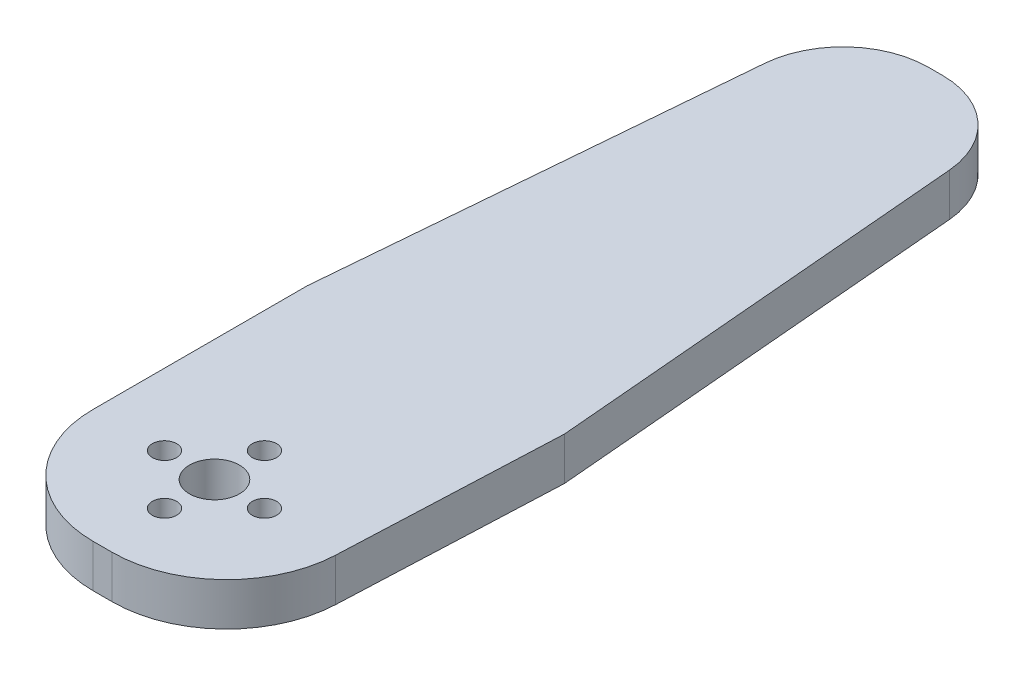
ISO-10303-21;
HEADER;
FILE_DESCRIPTION(('STEP AP214'),'2;1');
FILE_NAME('part.step','',(''),(''),'','','');
FILE_SCHEMA(('AUTOMOTIVE_DESIGN { 1 0 10303 214 1 1 1 1 }'));
ENDSEC;
DATA;
#1=APPLICATION_CONTEXT('core data for automotive mechanical design processes');
#2=APPLICATION_PROTOCOL_DEFINITION('international standard','automotive_design',2000,#1);
#3=PRODUCT_CONTEXT('',#1,'mechanical');
#4=PRODUCT('Part','Part','',(#3));
#5=PRODUCT_RELATED_PRODUCT_CATEGORY('part','',(#4));
#6=PRODUCT_DEFINITION_FORMATION('','',#4);
#7=PRODUCT_DEFINITION_CONTEXT('part definition',#1,'design');
#8=PRODUCT_DEFINITION('design','',#6,#7);
#9=PRODUCT_DEFINITION_SHAPE('','',#8);
#10=(LENGTH_UNIT() NAMED_UNIT(*) SI_UNIT(.MILLI.,.METRE.));
#11=(NAMED_UNIT(*) PLANE_ANGLE_UNIT() SI_UNIT($,.RADIAN.));
#12=(NAMED_UNIT(*) SI_UNIT($,.STERADIAN.) SOLID_ANGLE_UNIT());
#13=UNCERTAINTY_MEASURE_WITH_UNIT(LENGTH_MEASURE(1.E-05),#10,'distance_accuracy_value','');
#14=(GEOMETRIC_REPRESENTATION_CONTEXT(3) GLOBAL_UNCERTAINTY_ASSIGNED_CONTEXT((#13)) GLOBAL_UNIT_ASSIGNED_CONTEXT((#10,
#11,#12)) REPRESENTATION_CONTEXT('',''));
#15=CARTESIAN_POINT('',(0.,0.,0.));
#16=DIRECTION('',(0.,0.,1.));
#17=DIRECTION('',(1.,0.,0.));
#18=AXIS2_PLACEMENT_3D('',#15,#16,#17);
#19=CARTESIAN_POINT('',(-0.999970982587433,0.,-2.90174125647941E-05));
#20=DIRECTION('',(0.,-1.,0.));
#21=DIRECTION('',(0.,0.,-1.));
#22=AXIS2_PLACEMENT_3D('',#19,#20,#21);
#23=CYLINDRICAL_SURFACE('',#22,16.0000290174389);
#24=CARTESIAN_POINT('',(-0.999970982587433,-6.,-2.90174125647941E-05));
#25=DIRECTION('',(0.,1.,0.));
#26=DIRECTION('',(0.,0.,1.));
#27=AXIS2_PLACEMENT_3D('',#24,#25,#26);
#28=CIRCLE('',#27,16.0000290174389);
#29=CARTESIAN_POINT('',(-17.,-6.,0.));
#30=VERTEX_POINT('',#29);
#31=CARTESIAN_POINT('',(-1.,-6.,16.));
#32=VERTEX_POINT('',#31);
#33=EDGE_CURVE('E149',#30,#32,#28,.T.);
#34=ORIENTED_EDGE('',*,*,#33,.T.);
#35=DIRECTION('',(0.,-1.,0.));
#36=VECTOR('',#35,1.);
#37=CARTESIAN_POINT('',(-1.,0.,16.));
#38=LINE('',#37,#36);
#39=CARTESIAN_POINT('',(-1.,0.,16.));
#40=VERTEX_POINT('',#39);
#41=EDGE_CURVE('E11',#40,#32,#38,.T.);
#42=ORIENTED_EDGE('',*,*,#41,.F.);
#43=CARTESIAN_POINT('',(-0.999970982587433,0.,-2.90174125647941E-05));
#44=DIRECTION('',(0.,1.,0.));
#45=DIRECTION('',(0.,0.,1.));
#46=AXIS2_PLACEMENT_3D('',#43,#44,#45);
#47=CIRCLE('',#46,16.0000290174389);
#48=CARTESIAN_POINT('',(-17.,0.,0.));
#49=VERTEX_POINT('',#48);
#50=EDGE_CURVE('E169',#49,#40,#47,.T.);
#51=ORIENTED_EDGE('',*,*,#50,.F.);
#52=DIRECTION('',(0.,-1.,0.));
#53=VECTOR('',#52,1.);
#54=CARTESIAN_POINT('',(-17.,0.,0.));
#55=LINE('',#54,#53);
#56=EDGE_CURVE('E144',#49,#30,#55,.T.);
#57=ORIENTED_EDGE('',*,*,#56,.T.);
#58=EDGE_LOOP('',(#34,#42,#51,#57));
#59=FACE_BOUND('',#58,.T.);
#60=ADVANCED_FACE('F39',(#59),#23,.T.);
#61=CARTESIAN_POINT('',(-1.,0.,16.));
#62=DIRECTION('',(0.,0.,-1.));
#63=DIRECTION('',(-1.,0.,0.));
#64=AXIS2_PLACEMENT_3D('',#61,#62,#63);
#65=PLANE('',#64);
#66=DIRECTION('',(1.,0.,0.));
#67=VECTOR('',#66,1.);
#68=CARTESIAN_POINT('',(-1.,-6.,16.));
#69=LINE('',#68,#67);
#70=CARTESIAN_POINT('',(1.68049999999999,-6.,16.));
#71=VERTEX_POINT('',#70);
#72=EDGE_CURVE('E155',#32,#71,#69,.T.);
#73=ORIENTED_EDGE('',*,*,#72,.T.);
#74=DIRECTION('',(0.,-1.,0.));
#75=VECTOR('',#74,1.);
#76=CARTESIAN_POINT('',(1.68049999999999,0.,16.));
#77=LINE('',#76,#75);
#78=CARTESIAN_POINT('',(1.68049999999999,0.,16.));
#79=VERTEX_POINT('',#78);
#80=EDGE_CURVE('E48',#79,#71,#77,.T.);
#81=ORIENTED_EDGE('',*,*,#80,.F.);
#82=DIRECTION('',(1.,0.,0.));
#83=VECTOR('',#82,1.);
#84=CARTESIAN_POINT('',(-1.,0.,16.));
#85=LINE('',#84,#83);
#86=EDGE_CURVE('E106',#40,#79,#85,.T.);
#87=ORIENTED_EDGE('',*,*,#86,.F.);
#88=ORIENTED_EDGE('',*,*,#41,.T.);
#89=EDGE_LOOP('',(#73,#81,#87,#88));
#90=FACE_BOUND('',#89,.T.);
#91=ADVANCED_FACE('F281',(#90),#65,.F.);
#92=CARTESIAN_POINT('',(1.68053696198408,0.,3.68721737500216E-05));
#93=DIRECTION('',(0.,-1.,0.));
#94=DIRECTION('',(0.,0.,-1.));
#95=AXIS2_PLACEMENT_3D('',#92,#93,#94);
#96=CYLINDRICAL_SURFACE('',#95,15.9999631278689);
#97=CARTESIAN_POINT('',(1.68053696198408,-6.,3.68721737500216E-05));
#98=DIRECTION('',(0.,1.,0.));
#99=DIRECTION('',(0.,0.,1.));
#100=AXIS2_PLACEMENT_3D('',#97,#98,#99);
#101=CIRCLE('',#100,15.9999631278689);
#102=CARTESIAN_POINT('',(17.6654,-6.,0.695));
#103=VERTEX_POINT('',#102);
#104=EDGE_CURVE('E154',#71,#103,#101,.T.);
#105=ORIENTED_EDGE('',*,*,#104,.T.);
#106=DIRECTION('',(0.,-1.,0.));
#107=VECTOR('',#106,1.);
#108=CARTESIAN_POINT('',(17.6654,0.,0.695));
#109=LINE('',#108,#107);
#110=CARTESIAN_POINT('',(17.6654,0.,0.695));
#111=VERTEX_POINT('',#110);
#112=EDGE_CURVE('E182',#111,#103,#109,.T.);
#113=ORIENTED_EDGE('',*,*,#112,.F.);
#114=CARTESIAN_POINT('',(1.68053696198408,0.,3.68721737500216E-05));
#115=DIRECTION('',(0.,1.,0.));
#116=DIRECTION('',(0.,0.,1.));
#117=AXIS2_PLACEMENT_3D('',#114,#115,#116);
#118=CIRCLE('',#117,15.9999631278689);
#119=EDGE_CURVE('E248',#79,#111,#118,.T.);
#120=ORIENTED_EDGE('',*,*,#119,.F.);
#121=ORIENTED_EDGE('',*,*,#80,.T.);
#122=EDGE_LOOP('',(#105,#113,#120,#121));
#123=FACE_BOUND('',#122,.T.);
#124=ADVANCED_FACE('F289',(#123),#96,.T.);
#125=CARTESIAN_POINT('',(17.6654,0.,0.695));
#126=DIRECTION('',(-0.999056109225598,0.,-0.0434383542392077));
#127=DIRECTION('',(-0.0434383542392077,0.,0.999056109225598));
#128=AXIS2_PLACEMENT_3D('',#125,#126,#127);
#129=PLANE('',#128);
#130=DIRECTION('',(0.0434383542392077,0.,-0.999056109225598));
#131=VECTOR('',#130,1.);
#132=CARTESIAN_POINT('',(17.6654,-6.,0.695));
#133=LINE('',#132,#131);
#134=CARTESIAN_POINT('',(19.,-6.,-30.));
#135=VERTEX_POINT('',#134);
#136=EDGE_CURVE('E160',#103,#135,#133,.T.);
#137=ORIENTED_EDGE('',*,*,#136,.T.);
#138=DIRECTION('',(0.,-1.,0.));
#139=VECTOR('',#138,1.);
#140=CARTESIAN_POINT('',(19.,0.,-30.));
#141=LINE('',#140,#139);
#142=CARTESIAN_POINT('',(19.,0.,-30.));
#143=VERTEX_POINT('',#142);
#144=EDGE_CURVE('E178',#143,#135,#141,.T.);
#145=ORIENTED_EDGE('',*,*,#144,.F.);
#146=DIRECTION('',(0.0434383542392077,0.,-0.999056109225598));
#147=VECTOR('',#146,1.);
#148=CARTESIAN_POINT('',(17.6654,0.,0.695));
#149=LINE('',#148,#147);
#150=EDGE_CURVE('E246',#111,#143,#149,.T.);
#151=ORIENTED_EDGE('',*,*,#150,.F.);
#152=ORIENTED_EDGE('',*,*,#112,.T.);
#153=EDGE_LOOP('',(#137,#145,#151,#152));
#154=FACE_BOUND('',#153,.T.);
#155=ADVANCED_FACE('F291',(#154),#129,.F.);
#156=CARTESIAN_POINT('',(19.,0.,-30.));
#157=DIRECTION('',(-0.996346603900245,0.,0.0854016679956986));
#158=DIRECTION('',(0.0854016679956986,0.,0.996346603900245));
#159=AXIS2_PLACEMENT_3D('',#156,#157,#158);
#160=PLANE('',#159);
#161=DIRECTION('',(-0.0854016679956986,0.,-0.996346603900245));
#162=VECTOR('',#161,1.);
#163=CARTESIAN_POINT('',(19.,-6.,-30.));
#164=LINE('',#163,#162);
#165=CARTESIAN_POINT('',(13.9407,-6.,-89.0248));
#166=VERTEX_POINT('',#165);
#167=EDGE_CURVE('E157',#135,#166,#164,.T.);
#168=ORIENTED_EDGE('',*,*,#167,.T.);
#169=DIRECTION('',(0.,-1.,0.));
#170=VECTOR('',#169,1.);
#171=CARTESIAN_POINT('',(13.9407,0.,-89.0248));
#172=LINE('',#171,#170);
#173=CARTESIAN_POINT('',(13.9407,0.,-89.0248));
#174=VERTEX_POINT('',#173);
#175=EDGE_CURVE('E171',#174,#166,#172,.T.);
#176=ORIENTED_EDGE('',*,*,#175,.F.);
#177=DIRECTION('',(-0.0854016679956986,0.,-0.996346603900245));
#178=VECTOR('',#177,1.);
#179=CARTESIAN_POINT('',(19.,0.,-30.));
#180=LINE('',#179,#178);
#181=EDGE_CURVE('E252',#143,#174,#180,.T.);
#182=ORIENTED_EDGE('',*,*,#181,.F.);
#183=ORIENTED_EDGE('',*,*,#144,.T.);
#184=EDGE_LOOP('',(#168,#176,#182,#183));
#185=FACE_BOUND('',#184,.T.);
#186=ADVANCED_FACE('F299',(#185),#160,.F.);
#187=CARTESIAN_POINT('',(1.98455021733739,0.,-88.0000121791409));
#188=DIRECTION('',(0.,-1.,0.));
#189=DIRECTION('',(0.,0.,-1.));
#190=AXIS2_PLACEMENT_3D('',#187,#188,#189);
#191=CYLINDRICAL_SURFACE('',#190,11.9999878209623);
#192=CARTESIAN_POINT('',(1.98455021733739,-6.,-88.0000121791409));
#193=DIRECTION('',(0.,1.,0.));
#194=DIRECTION('',(0.,0.,1.));
#195=AXIS2_PLACEMENT_3D('',#192,#193,#194);
#196=CIRCLE('',#195,11.9999878209623);
#197=CARTESIAN_POINT('',(1.9846,-6.,-100.));
#198=VERTEX_POINT('',#197);
#199=EDGE_CURVE('E161',#166,#198,#196,.T.);
#200=ORIENTED_EDGE('',*,*,#199,.T.);
#201=DIRECTION('',(0.,-1.,0.));
#202=VECTOR('',#201,1.);
#203=CARTESIAN_POINT('',(1.9846,0.,-100.));
#204=LINE('',#203,#202);
#205=CARTESIAN_POINT('',(1.9846,0.,-100.));
#206=VERTEX_POINT('',#205);
#207=EDGE_CURVE('E175',#206,#198,#204,.T.);
#208=ORIENTED_EDGE('',*,*,#207,.F.);
#209=CARTESIAN_POINT('',(1.98455021733739,0.,-88.0000121791409));
#210=DIRECTION('',(0.,1.,0.));
#211=DIRECTION('',(0.,0.,1.));
#212=AXIS2_PLACEMENT_3D('',#209,#210,#211);
#213=CIRCLE('',#212,11.9999878209623);
#214=EDGE_CURVE('E255',#174,#206,#213,.T.);
#215=ORIENTED_EDGE('',*,*,#214,.F.);
#216=ORIENTED_EDGE('',*,*,#175,.T.);
#217=EDGE_LOOP('',(#200,#208,#215,#216));
#218=FACE_BOUND('',#217,.T.);
#219=ADVANCED_FACE('F257',(#218),#191,.T.);
#220=CARTESIAN_POINT('',(1.9846,0.,-100.));
#221=DIRECTION('',(0.,0.,1.));
#222=DIRECTION('',(1.,0.,0.));
#223=AXIS2_PLACEMENT_3D('',#220,#221,#222);
#224=PLANE('',#223);
#225=DIRECTION('',(-1.,0.,0.));
#226=VECTOR('',#225,1.);
#227=CARTESIAN_POINT('',(1.9846,-6.,-100.));
#228=LINE('',#227,#226);
#229=CARTESIAN_POINT('',(0.0154000000000048,-6.,-100.));
#230=VERTEX_POINT('',#229);
#231=EDGE_CURVE('E162',#198,#230,#228,.T.);
#232=ORIENTED_EDGE('',*,*,#231,.T.);
#233=DIRECTION('',(0.,-1.,0.));
#234=VECTOR('',#233,1.);
#235=CARTESIAN_POINT('',(0.0154000000000048,0.,-100.));
#236=LINE('',#235,#234);
#237=CARTESIAN_POINT('',(0.0154000000000048,0.,-100.));
#238=VERTEX_POINT('',#237);
#239=EDGE_CURVE('E136',#238,#230,#236,.T.);
#240=ORIENTED_EDGE('',*,*,#239,.F.);
#241=DIRECTION('',(-1.,0.,0.));
#242=VECTOR('',#241,1.);
#243=CARTESIAN_POINT('',(1.9846,0.,-100.));
#244=LINE('',#243,#242);
#245=EDGE_CURVE('E132',#206,#238,#244,.T.);
#246=ORIENTED_EDGE('',*,*,#245,.F.);
#247=ORIENTED_EDGE('',*,*,#207,.T.);
#248=EDGE_LOOP('',(#232,#240,#246,#247));
#249=FACE_BOUND('',#248,.T.);
#250=ADVANCED_FACE('F262',(#249),#224,.F.);
#251=CARTESIAN_POINT('',(0.0154497826626082,0.,-88.0000121791409));
#252=DIRECTION('',(0.,-1.,0.));
#253=DIRECTION('',(0.,0.,-1.));
#254=AXIS2_PLACEMENT_3D('',#251,#252,#253);
#255=CYLINDRICAL_SURFACE('',#254,11.9999878209623);
#256=CARTESIAN_POINT('',(0.0154497826626082,-6.,-88.0000121791409));
#257=DIRECTION('',(0.,1.,0.));
#258=DIRECTION('',(0.,0.,1.));
#259=AXIS2_PLACEMENT_3D('',#256,#257,#258);
#260=CIRCLE('',#259,11.9999878209623);
#261=CARTESIAN_POINT('',(-11.9407,-6.,-89.0248));
#262=VERTEX_POINT('',#261);
#263=EDGE_CURVE('E139',#230,#262,#260,.T.);
#264=ORIENTED_EDGE('',*,*,#263,.T.);
#265=DIRECTION('',(0.,-1.,0.));
#266=VECTOR('',#265,1.);
#267=CARTESIAN_POINT('',(-11.9407,0.,-89.0248));
#268=LINE('',#267,#266);
#269=CARTESIAN_POINT('',(-11.9407,0.,-89.0248));
#270=VERTEX_POINT('',#269);
#271=EDGE_CURVE('E137',#270,#262,#268,.T.);
#272=ORIENTED_EDGE('',*,*,#271,.F.);
#273=CARTESIAN_POINT('',(0.0154497826626082,0.,-88.0000121791409));
#274=DIRECTION('',(0.,1.,0.));
#275=DIRECTION('',(0.,0.,1.));
#276=AXIS2_PLACEMENT_3D('',#273,#274,#275);
#277=CIRCLE('',#276,11.9999878209623);
#278=EDGE_CURVE('E121',#238,#270,#277,.T.);
#279=ORIENTED_EDGE('',*,*,#278,.F.);
#280=ORIENTED_EDGE('',*,*,#239,.T.);
#281=EDGE_LOOP('',(#264,#272,#279,#280));
#282=FACE_BOUND('',#281,.T.);
#283=ADVANCED_FACE('F140',(#282),#255,.T.);
#284=CARTESIAN_POINT('',(-11.9407,0.,-89.0248));
#285=DIRECTION('',(0.996346603900245,0.,0.0854016679956986));
#286=DIRECTION('',(0.0854016679956986,0.,-0.996346603900245));
#287=AXIS2_PLACEMENT_3D('',#284,#285,#286);
#288=PLANE('',#287);
#289=DIRECTION('',(-0.0854016679956986,0.,0.996346603900245));
#290=VECTOR('',#289,1.);
#291=CARTESIAN_POINT('',(-11.9407,-6.,-89.0248));
#292=LINE('',#291,#290);
#293=CARTESIAN_POINT('',(-17.,-6.,-30.));
#294=VERTEX_POINT('',#293);
#295=EDGE_CURVE('E95',#262,#294,#292,.T.);
#296=ORIENTED_EDGE('',*,*,#295,.T.);
#297=DIRECTION('',(0.,-1.,0.));
#298=VECTOR('',#297,1.);
#299=CARTESIAN_POINT('',(-17.,0.,-30.));
#300=LINE('',#299,#298);
#301=CARTESIAN_POINT('',(-17.,0.,-30.));
#302=VERTEX_POINT('',#301);
#303=EDGE_CURVE('E143',#302,#294,#300,.T.);
#304=ORIENTED_EDGE('',*,*,#303,.F.);
#305=DIRECTION('',(-0.0854016679956986,0.,0.996346603900245));
#306=VECTOR('',#305,1.);
#307=CARTESIAN_POINT('',(-11.9407,0.,-89.0248));
#308=LINE('',#307,#306);
#309=EDGE_CURVE('E129',#270,#302,#308,.T.);
#310=ORIENTED_EDGE('',*,*,#309,.F.);
#311=ORIENTED_EDGE('',*,*,#271,.T.);
#312=EDGE_LOOP('',(#296,#304,#310,#311));
#313=FACE_BOUND('',#312,.T.);
#314=ADVANCED_FACE('F141',(#313),#288,.F.);
#315=CARTESIAN_POINT('',(-17.,0.,-30.));
#316=DIRECTION('',(1.,0.,0.));
#317=DIRECTION('',(0.,0.,-1.));
#318=AXIS2_PLACEMENT_3D('',#315,#316,#317);
#319=PLANE('',#318);
#320=DIRECTION('',(0.,0.,1.));
#321=VECTOR('',#320,1.);
#322=CARTESIAN_POINT('',(-17.,-6.,-30.));
#323=LINE('',#322,#321);
#324=EDGE_CURVE('E98',#294,#30,#323,.T.);
#325=ORIENTED_EDGE('',*,*,#324,.T.);
#326=ORIENTED_EDGE('',*,*,#56,.F.);
#327=DIRECTION('',(0.,0.,1.));
#328=VECTOR('',#327,1.);
#329=CARTESIAN_POINT('',(-17.,0.,-30.));
#330=LINE('',#329,#328);
#331=EDGE_CURVE('E60',#302,#49,#330,.T.);
#332=ORIENTED_EDGE('',*,*,#331,.F.);
#333=ORIENTED_EDGE('',*,*,#303,.T.);
#334=EDGE_LOOP('',(#325,#326,#332,#333));
#335=FACE_BOUND('',#334,.T.);
#336=ADVANCED_FACE('F275',(#335),#319,.F.);
#337=CARTESIAN_POINT('',(-0.999970982587433,0.,-2.90174125647941E-05));
#338=DIRECTION('',(0.,1.,0.));
#339=DIRECTION('',(0.,0.,1.));
#340=AXIS2_PLACEMENT_3D('',#337,#338,#339);
#341=PLANE('',#340);
#342=CARTESIAN_POINT('',(0.,0.,-7.));
#343=DIRECTION('',(0.,1.,0.));
#344=DIRECTION('',(0.,0.,1.));
#345=AXIS2_PLACEMENT_3D('',#342,#343,#344);
#346=CIRCLE('',#345,1.7);
#347=CARTESIAN_POINT('',(0.,0.,-5.3));
#348=VERTEX_POINT('',#347);
#349=EDGE_CURVE('E196',#348,#348,#346,.F.);
#350=ORIENTED_EDGE('',*,*,#349,.T.);
#351=EDGE_LOOP('',(#350));
#352=FACE_BOUND('',#351,.T.);
#353=CARTESIAN_POINT('',(-7.,0.,0.));
#354=DIRECTION('',(0.,1.,0.));
#355=DIRECTION('',(0.,0.,1.));
#356=AXIS2_PLACEMENT_3D('',#353,#354,#355);
#357=CIRCLE('',#356,1.7);
#358=CARTESIAN_POINT('',(-7.,0.,1.7));
#359=VERTEX_POINT('',#358);
#360=EDGE_CURVE('E232',#359,#359,#357,.F.);
#361=ORIENTED_EDGE('',*,*,#360,.T.);
#362=EDGE_LOOP('',(#361));
#363=FACE_BOUND('',#362,.T.);
#364=CARTESIAN_POINT('',(0.,0.,7.));
#365=DIRECTION('',(0.,1.,0.));
#366=DIRECTION('',(0.,0.,1.));
#367=AXIS2_PLACEMENT_3D('',#364,#365,#366);
#368=CIRCLE('',#367,1.7);
#369=CARTESIAN_POINT('',(0.,0.,8.7));
#370=VERTEX_POINT('',#369);
#371=EDGE_CURVE('E234',#370,#370,#368,.F.);
#372=ORIENTED_EDGE('',*,*,#371,.T.);
#373=EDGE_LOOP('',(#372));
#374=FACE_BOUND('',#373,.T.);
#375=CARTESIAN_POINT('',(7.,0.,0.));
#376=DIRECTION('',(0.,1.,0.));
#377=DIRECTION('',(0.,0.,1.));
#378=AXIS2_PLACEMENT_3D('',#375,#376,#377);
#379=CIRCLE('',#378,1.7);
#380=CARTESIAN_POINT('',(7.,0.,1.7));
#381=VERTEX_POINT('',#380);
#382=EDGE_CURVE('E186',#381,#381,#379,.F.);
#383=ORIENTED_EDGE('',*,*,#382,.T.);
#384=EDGE_LOOP('',(#383));
#385=FACE_BOUND('',#384,.T.);
#386=CARTESIAN_POINT('',(0.,0.,0.));
#387=DIRECTION('',(0.,1.,0.));
#388=DIRECTION('',(0.,0.,1.));
#389=AXIS2_PLACEMENT_3D('',#386,#387,#388);
#390=CIRCLE('',#389,3.5);
#391=CARTESIAN_POINT('',(0.,0.,3.5));
#392=VERTEX_POINT('',#391);
#393=EDGE_CURVE('E189',#392,#392,#390,.F.);
#394=ORIENTED_EDGE('',*,*,#393,.T.);
#395=EDGE_LOOP('',(#394));
#396=FACE_BOUND('',#395,.T.);
#397=ORIENTED_EDGE('',*,*,#50,.T.);
#398=ORIENTED_EDGE('',*,*,#86,.T.);
#399=ORIENTED_EDGE('',*,*,#119,.T.);
#400=ORIENTED_EDGE('',*,*,#150,.T.);
#401=ORIENTED_EDGE('',*,*,#181,.T.);
#402=ORIENTED_EDGE('',*,*,#214,.T.);
#403=ORIENTED_EDGE('',*,*,#245,.T.);
#404=ORIENTED_EDGE('',*,*,#278,.T.);
#405=ORIENTED_EDGE('',*,*,#309,.T.);
#406=ORIENTED_EDGE('',*,*,#331,.T.);
#407=EDGE_LOOP('',(#397,#398,#399,#400,#401,#402,#403,#404,#405,#406));
#408=FACE_BOUND('',#407,.T.);
#409=ADVANCED_FACE('F130',(#352,#363,#374,#385,#396,#408),#341,.T.);
#410=CARTESIAN_POINT('',(-0.999970982587433,-6.,-2.90174125647941E-05));
#411=DIRECTION('',(0.,1.,0.));
#412=DIRECTION('',(0.,0.,1.));
#413=AXIS2_PLACEMENT_3D('',#410,#411,#412);
#414=PLANE('',#413);
#415=CARTESIAN_POINT('',(0.,-6.,0.));
#416=DIRECTION('',(0.,1.,0.));
#417=DIRECTION('',(0.,0.,1.));
#418=AXIS2_PLACEMENT_3D('',#415,#416,#417);
#419=CIRCLE('',#418,12.5);
#420=CARTESIAN_POINT('',(0.,-6.,12.5));
#421=VERTEX_POINT('',#420);
#422=EDGE_CURVE('E153',#421,#421,#419,.T.);
#423=ORIENTED_EDGE('',*,*,#422,.T.);
#424=EDGE_LOOP('',(#423));
#425=FACE_BOUND('',#424,.T.);
#426=ORIENTED_EDGE('',*,*,#33,.F.);
#427=ORIENTED_EDGE('',*,*,#324,.F.);
#428=ORIENTED_EDGE('',*,*,#295,.F.);
#429=ORIENTED_EDGE('',*,*,#263,.F.);
#430=ORIENTED_EDGE('',*,*,#231,.F.);
#431=ORIENTED_EDGE('',*,*,#199,.F.);
#432=ORIENTED_EDGE('',*,*,#167,.F.);
#433=ORIENTED_EDGE('',*,*,#136,.F.);
#434=ORIENTED_EDGE('',*,*,#104,.F.);
#435=ORIENTED_EDGE('',*,*,#72,.F.);
#436=EDGE_LOOP('',(#426,#427,#428,#429,#430,#431,#432,#433,#434,#435));
#437=FACE_BOUND('',#436,.T.);
#438=ADVANCED_FACE('F270',(#425,#437),#414,.F.);
#439=CARTESIAN_POINT('',(0.,-6.,0.));
#440=DIRECTION('',(0.,-1.,0.));
#441=DIRECTION('',(0.,0.,-1.));
#442=AXIS2_PLACEMENT_3D('',#439,#440,#441);
#443=CYLINDRICAL_SURFACE('',#442,12.5);
#444=ORIENTED_EDGE('',*,*,#422,.F.);
#445=EDGE_LOOP('',(#444));
#446=FACE_BOUND('',#445,.T.);
#447=CARTESIAN_POINT('',(0.,-8.,0.));
#448=DIRECTION('',(0.,1.,0.));
#449=DIRECTION('',(0.,0.,1.));
#450=AXIS2_PLACEMENT_3D('',#447,#448,#449);
#451=CIRCLE('',#450,12.5);
#452=CARTESIAN_POINT('',(0.,-8.,12.5));
#453=VERTEX_POINT('',#452);
#454=EDGE_CURVE('E242',#453,#453,#451,.T.);
#455=ORIENTED_EDGE('',*,*,#454,.T.);
#456=EDGE_LOOP('',(#455));
#457=FACE_BOUND('',#456,.T.);
#458=ADVANCED_FACE('F339',(#446,#457),#443,.T.);
#459=CARTESIAN_POINT('',(0.,-8.,0.));
#460=DIRECTION('',(0.,1.,0.));
#461=DIRECTION('',(0.,0.,1.));
#462=AXIS2_PLACEMENT_3D('',#459,#460,#461);
#463=PLANE('',#462);
#464=CARTESIAN_POINT('',(0.,-8.,-7.));
#465=DIRECTION('',(0.,1.,0.));
#466=DIRECTION('',(0.,0.,1.));
#467=AXIS2_PLACEMENT_3D('',#464,#465,#466);
#468=CIRCLE('',#467,3.2);
#469=CARTESIAN_POINT('',(0.,-8.,-3.8));
#470=VERTEX_POINT('',#469);
#471=EDGE_CURVE('E45',#470,#470,#468,.F.);
#472=ORIENTED_EDGE('',*,*,#471,.F.);
#473=EDGE_LOOP('',(#472));
#474=FACE_BOUND('',#473,.T.);
#475=CARTESIAN_POINT('',(-7.,-8.,0.));
#476=DIRECTION('',(0.,1.,0.));
#477=DIRECTION('',(0.,0.,1.));
#478=AXIS2_PLACEMENT_3D('',#475,#476,#477);
#479=CIRCLE('',#478,3.2);
#480=CARTESIAN_POINT('',(-7.,-8.,3.2));
#481=VERTEX_POINT('',#480);
#482=EDGE_CURVE('E207',#481,#481,#479,.F.);
#483=ORIENTED_EDGE('',*,*,#482,.F.);
#484=EDGE_LOOP('',(#483));
#485=FACE_BOUND('',#484,.T.);
#486=CARTESIAN_POINT('',(0.,-8.,7.));
#487=DIRECTION('',(0.,1.,0.));
#488=DIRECTION('',(0.,0.,1.));
#489=AXIS2_PLACEMENT_3D('',#486,#487,#488);
#490=CIRCLE('',#489,3.2);
#491=CARTESIAN_POINT('',(0.,-8.,10.2));
#492=VERTEX_POINT('',#491);
#493=EDGE_CURVE('E205',#492,#492,#490,.F.);
#494=ORIENTED_EDGE('',*,*,#493,.F.);
#495=EDGE_LOOP('',(#494));
#496=FACE_BOUND('',#495,.T.);
#497=CARTESIAN_POINT('',(7.,-8.,0.));
#498=DIRECTION('',(0.,1.,0.));
#499=DIRECTION('',(0.,0.,1.));
#500=AXIS2_PLACEMENT_3D('',#497,#498,#499);
#501=CIRCLE('',#500,3.2);
#502=CARTESIAN_POINT('',(7.,-8.,3.2));
#503=VERTEX_POINT('',#502);
#504=EDGE_CURVE('E194',#503,#503,#501,.F.);
#505=ORIENTED_EDGE('',*,*,#504,.F.);
#506=EDGE_LOOP('',(#505));
#507=FACE_BOUND('',#506,.T.);
#508=CARTESIAN_POINT('',(0.,-8.,0.));
#509=DIRECTION('',(0.,1.,0.));
#510=DIRECTION('',(0.,0.,1.));
#511=AXIS2_PLACEMENT_3D('',#508,#509,#510);
#512=CIRCLE('',#511,3.5);
#513=CARTESIAN_POINT('',(0.,-8.,3.5));
#514=VERTEX_POINT('',#513);
#515=EDGE_CURVE('E187',#514,#514,#512,.F.);
#516=ORIENTED_EDGE('',*,*,#515,.F.);
#517=EDGE_LOOP('',(#516));
#518=FACE_BOUND('',#517,.T.);
#519=ORIENTED_EDGE('',*,*,#454,.F.);
#520=EDGE_LOOP('',(#519));
#521=FACE_BOUND('',#520,.T.);
#522=ADVANCED_FACE('F346',(#474,#485,#496,#507,#518,#521),#463,.F.);
#523=CARTESIAN_POINT('',(0.,0.0999999999999994,0.));
#524=DIRECTION('',(0.,-1.,0.));
#525=DIRECTION('',(0.,0.,-1.));
#526=AXIS2_PLACEMENT_3D('',#523,#524,#525);
#527=CYLINDRICAL_SURFACE('',#526,3.5);
#528=ORIENTED_EDGE('',*,*,#393,.F.);
#529=EDGE_LOOP('',(#528));
#530=FACE_BOUND('',#529,.T.);
#531=ORIENTED_EDGE('',*,*,#515,.T.);
#532=EDGE_LOOP('',(#531));
#533=FACE_BOUND('',#532,.T.);
#534=ADVANCED_FACE('F358',(#530,#533),#527,.F.);
#535=CARTESIAN_POINT('',(7.,0.0999999999999994,0.));
#536=DIRECTION('',(0.,-1.,0.));
#537=DIRECTION('',(0.,0.,-1.));
#538=AXIS2_PLACEMENT_3D('',#535,#536,#537);
#539=CYLINDRICAL_SURFACE('',#538,1.7);
#540=CARTESIAN_POINT('',(7.,-3.,0.));
#541=DIRECTION('',(0.,1.,0.));
#542=DIRECTION('',(0.,0.,1.));
#543=AXIS2_PLACEMENT_3D('',#540,#541,#542);
#544=CIRCLE('',#543,1.7);
#545=CARTESIAN_POINT('',(7.,-3.,1.7));
#546=VERTEX_POINT('',#545);
#547=EDGE_CURVE('E192',#546,#546,#544,.T.);
#548=ORIENTED_EDGE('',*,*,#547,.F.);
#549=EDGE_LOOP('',(#548));
#550=FACE_BOUND('',#549,.T.);
#551=ORIENTED_EDGE('',*,*,#382,.F.);
#552=EDGE_LOOP('',(#551));
#553=FACE_BOUND('',#552,.T.);
#554=ADVANCED_FACE('F369',(#550,#553),#539,.F.);
#555=CARTESIAN_POINT('',(0.,0.0999999999999994,7.));
#556=DIRECTION('',(0.,-1.,0.));
#557=DIRECTION('',(0.,0.,-1.));
#558=AXIS2_PLACEMENT_3D('',#555,#556,#557);
#559=CYLINDRICAL_SURFACE('',#558,1.7);
#560=CARTESIAN_POINT('',(0.,-3.,7.));
#561=DIRECTION('',(0.,1.,0.));
#562=DIRECTION('',(0.,0.,1.));
#563=AXIS2_PLACEMENT_3D('',#560,#561,#562);
#564=CIRCLE('',#563,1.7);
#565=CARTESIAN_POINT('',(0.,-3.,8.7));
#566=VERTEX_POINT('',#565);
#567=EDGE_CURVE('E200',#566,#566,#564,.T.);
#568=ORIENTED_EDGE('',*,*,#567,.F.);
#569=EDGE_LOOP('',(#568));
#570=FACE_BOUND('',#569,.T.);
#571=ORIENTED_EDGE('',*,*,#371,.F.);
#572=EDGE_LOOP('',(#571));
#573=FACE_BOUND('',#572,.T.);
#574=ADVANCED_FACE('F378',(#570,#573),#559,.F.);
#575=CARTESIAN_POINT('',(-7.,0.0999999999999994,0.));
#576=DIRECTION('',(0.,-1.,0.));
#577=DIRECTION('',(0.,0.,-1.));
#578=AXIS2_PLACEMENT_3D('',#575,#576,#577);
#579=CYLINDRICAL_SURFACE('',#578,1.7);
#580=CARTESIAN_POINT('',(-7.,-3.,0.));
#581=DIRECTION('',(0.,1.,0.));
#582=DIRECTION('',(0.,0.,1.));
#583=AXIS2_PLACEMENT_3D('',#580,#581,#582);
#584=CIRCLE('',#583,1.7);
#585=CARTESIAN_POINT('',(-7.,-3.,1.7));
#586=VERTEX_POINT('',#585);
#587=EDGE_CURVE('E206',#586,#586,#584,.T.);
#588=ORIENTED_EDGE('',*,*,#587,.F.);
#589=EDGE_LOOP('',(#588));
#590=FACE_BOUND('',#589,.T.);
#591=ORIENTED_EDGE('',*,*,#360,.F.);
#592=EDGE_LOOP('',(#591));
#593=FACE_BOUND('',#592,.T.);
#594=ADVANCED_FACE('F386',(#590,#593),#579,.F.);
#595=CARTESIAN_POINT('',(0.,0.0999999999999994,-7.));
#596=DIRECTION('',(0.,-1.,0.));
#597=DIRECTION('',(0.,0.,-1.));
#598=AXIS2_PLACEMENT_3D('',#595,#596,#597);
#599=CYLINDRICAL_SURFACE('',#598,1.7);
#600=CARTESIAN_POINT('',(0.,-3.,-7.));
#601=DIRECTION('',(0.,1.,0.));
#602=DIRECTION('',(0.,0.,1.));
#603=AXIS2_PLACEMENT_3D('',#600,#601,#602);
#604=CIRCLE('',#603,1.7);
#605=CARTESIAN_POINT('',(0.,-3.,-5.3));
#606=VERTEX_POINT('',#605);
#607=EDGE_CURVE('E215',#606,#606,#604,.T.);
#608=ORIENTED_EDGE('',*,*,#607,.F.);
#609=EDGE_LOOP('',(#608));
#610=FACE_BOUND('',#609,.T.);
#611=ORIENTED_EDGE('',*,*,#349,.F.);
#612=EDGE_LOOP('',(#611));
#613=FACE_BOUND('',#612,.T.);
#614=ADVANCED_FACE('F402',(#610,#613),#599,.F.);
#615=CARTESIAN_POINT('',(7.,-3.,0.));
#616=DIRECTION('',(0.,-1.,0.));
#617=DIRECTION('',(0.,0.,-1.));
#618=AXIS2_PLACEMENT_3D('',#615,#616,#617);
#619=CYLINDRICAL_SURFACE('',#618,3.2);
#620=CARTESIAN_POINT('',(7.,-3.,0.));
#621=DIRECTION('',(0.,1.,0.));
#622=DIRECTION('',(0.,0.,1.));
#623=AXIS2_PLACEMENT_3D('',#620,#621,#622);
#624=CIRCLE('',#623,3.2);
#625=CARTESIAN_POINT('',(7.,-3.,3.2));
#626=VERTEX_POINT('',#625);
#627=EDGE_CURVE('E191',#626,#626,#624,.T.);
#628=ORIENTED_EDGE('',*,*,#627,.T.);
#629=EDGE_LOOP('',(#628));
#630=FACE_BOUND('',#629,.T.);
#631=ORIENTED_EDGE('',*,*,#504,.T.);
#632=EDGE_LOOP('',(#631));
#633=FACE_BOUND('',#632,.T.);
#634=ADVANCED_FACE('F415',(#630,#633),#619,.F.);
#635=CARTESIAN_POINT('',(7.,-3.,0.));
#636=DIRECTION('',(0.,1.,0.));
#637=DIRECTION('',(0.,0.,1.));
#638=AXIS2_PLACEMENT_3D('',#635,#636,#637);
#639=PLANE('',#638);
#640=ORIENTED_EDGE('',*,*,#547,.T.);
#641=EDGE_LOOP('',(#640));
#642=FACE_BOUND('',#641,.T.);
#643=ORIENTED_EDGE('',*,*,#627,.F.);
#644=EDGE_LOOP('',(#643));
#645=FACE_BOUND('',#644,.T.);
#646=ADVANCED_FACE('F425',(#642,#645),#639,.F.);
#647=CARTESIAN_POINT('',(0.,-3.,7.));
#648=DIRECTION('',(0.,-1.,0.));
#649=DIRECTION('',(0.,0.,-1.));
#650=AXIS2_PLACEMENT_3D('',#647,#648,#649);
#651=CYLINDRICAL_SURFACE('',#650,3.2);
#652=CARTESIAN_POINT('',(0.,-3.,7.));
#653=DIRECTION('',(0.,1.,0.));
#654=DIRECTION('',(0.,0.,1.));
#655=AXIS2_PLACEMENT_3D('',#652,#653,#654);
#656=CIRCLE('',#655,3.2);
#657=CARTESIAN_POINT('',(0.,-3.,10.2));
#658=VERTEX_POINT('',#657);
#659=EDGE_CURVE('E201',#658,#658,#656,.T.);
#660=ORIENTED_EDGE('',*,*,#659,.T.);
#661=EDGE_LOOP('',(#660));
#662=FACE_BOUND('',#661,.T.);
#663=ORIENTED_EDGE('',*,*,#493,.T.);
#664=EDGE_LOOP('',(#663));
#665=FACE_BOUND('',#664,.T.);
#666=ADVANCED_FACE('F431',(#662,#665),#651,.F.);
#667=CARTESIAN_POINT('',(0.,-3.,7.));
#668=DIRECTION('',(0.,1.,0.));
#669=DIRECTION('',(0.,0.,1.));
#670=AXIS2_PLACEMENT_3D('',#667,#668,#669);
#671=PLANE('',#670);
#672=ORIENTED_EDGE('',*,*,#567,.T.);
#673=EDGE_LOOP('',(#672));
#674=FACE_BOUND('',#673,.T.);
#675=ORIENTED_EDGE('',*,*,#659,.F.);
#676=EDGE_LOOP('',(#675));
#677=FACE_BOUND('',#676,.T.);
#678=ADVANCED_FACE('F439',(#674,#677),#671,.F.);
#679=CARTESIAN_POINT('',(-7.,-3.,0.));
#680=DIRECTION('',(0.,-1.,0.));
#681=DIRECTION('',(0.,0.,-1.));
#682=AXIS2_PLACEMENT_3D('',#679,#680,#681);
#683=CYLINDRICAL_SURFACE('',#682,3.2);
#684=CARTESIAN_POINT('',(-7.,-3.,0.));
#685=DIRECTION('',(0.,1.,0.));
#686=DIRECTION('',(0.,0.,1.));
#687=AXIS2_PLACEMENT_3D('',#684,#685,#686);
#688=CIRCLE('',#687,3.2);
#689=CARTESIAN_POINT('',(-7.,-3.,3.2));
#690=VERTEX_POINT('',#689);
#691=EDGE_CURVE('E209',#690,#690,#688,.T.);
#692=ORIENTED_EDGE('',*,*,#691,.T.);
#693=EDGE_LOOP('',(#692));
#694=FACE_BOUND('',#693,.T.);
#695=ORIENTED_EDGE('',*,*,#482,.T.);
#696=EDGE_LOOP('',(#695));
#697=FACE_BOUND('',#696,.T.);
#698=ADVANCED_FACE('F449',(#694,#697),#683,.F.);
#699=CARTESIAN_POINT('',(-7.,-3.,0.));
#700=DIRECTION('',(0.,1.,0.));
#701=DIRECTION('',(0.,0.,1.));
#702=AXIS2_PLACEMENT_3D('',#699,#700,#701);
#703=PLANE('',#702);
#704=ORIENTED_EDGE('',*,*,#587,.T.);
#705=EDGE_LOOP('',(#704));
#706=FACE_BOUND('',#705,.T.);
#707=ORIENTED_EDGE('',*,*,#691,.F.);
#708=EDGE_LOOP('',(#707));
#709=FACE_BOUND('',#708,.T.);
#710=ADVANCED_FACE('F456',(#706,#709),#703,.F.);
#711=CARTESIAN_POINT('',(0.,-3.,-7.));
#712=DIRECTION('',(0.,-1.,0.));
#713=DIRECTION('',(0.,0.,-1.));
#714=AXIS2_PLACEMENT_3D('',#711,#712,#713);
#715=CYLINDRICAL_SURFACE('',#714,3.2);
#716=CARTESIAN_POINT('',(0.,-3.,-7.));
#717=DIRECTION('',(0.,1.,0.));
#718=DIRECTION('',(0.,0.,1.));
#719=AXIS2_PLACEMENT_3D('',#716,#717,#718);
#720=CIRCLE('',#719,3.2);
#721=CARTESIAN_POINT('',(0.,-3.,-3.8));
#722=VERTEX_POINT('',#721);
#723=EDGE_CURVE('E212',#722,#722,#720,.T.);
#724=ORIENTED_EDGE('',*,*,#723,.T.);
#725=EDGE_LOOP('',(#724));
#726=FACE_BOUND('',#725,.T.);
#727=ORIENTED_EDGE('',*,*,#471,.T.);
#728=EDGE_LOOP('',(#727));
#729=FACE_BOUND('',#728,.T.);
#730=ADVANCED_FACE('F470',(#726,#729),#715,.F.);
#731=CARTESIAN_POINT('',(0.,-3.,-7.));
#732=DIRECTION('',(0.,1.,0.));
#733=DIRECTION('',(0.,0.,1.));
#734=AXIS2_PLACEMENT_3D('',#731,#732,#733);
#735=PLANE('',#734);
#736=ORIENTED_EDGE('',*,*,#607,.T.);
#737=EDGE_LOOP('',(#736));
#738=FACE_BOUND('',#737,.T.);
#739=ORIENTED_EDGE('',*,*,#723,.F.);
#740=EDGE_LOOP('',(#739));
#741=FACE_BOUND('',#740,.T.);
#742=ADVANCED_FACE('F478',(#738,#741),#735,.F.);
#743=CLOSED_SHELL('',(#60,#91,#124,#155,#186,#219,#250,#283,#314,#336,#409,#438,#458,#522,#534,
#554,#574,#594,#614,#634,#646,#666,#678,#698,#710,#730,#742));
#744=MANIFOLD_SOLID_BREP('B2',#743);
#745=ADVANCED_BREP_SHAPE_REPRESENTATION('',(#18,#744),#14);
#746=SHAPE_DEFINITION_REPRESENTATION(#9,#745);
ENDSEC;
END-ISO-10303-21;
